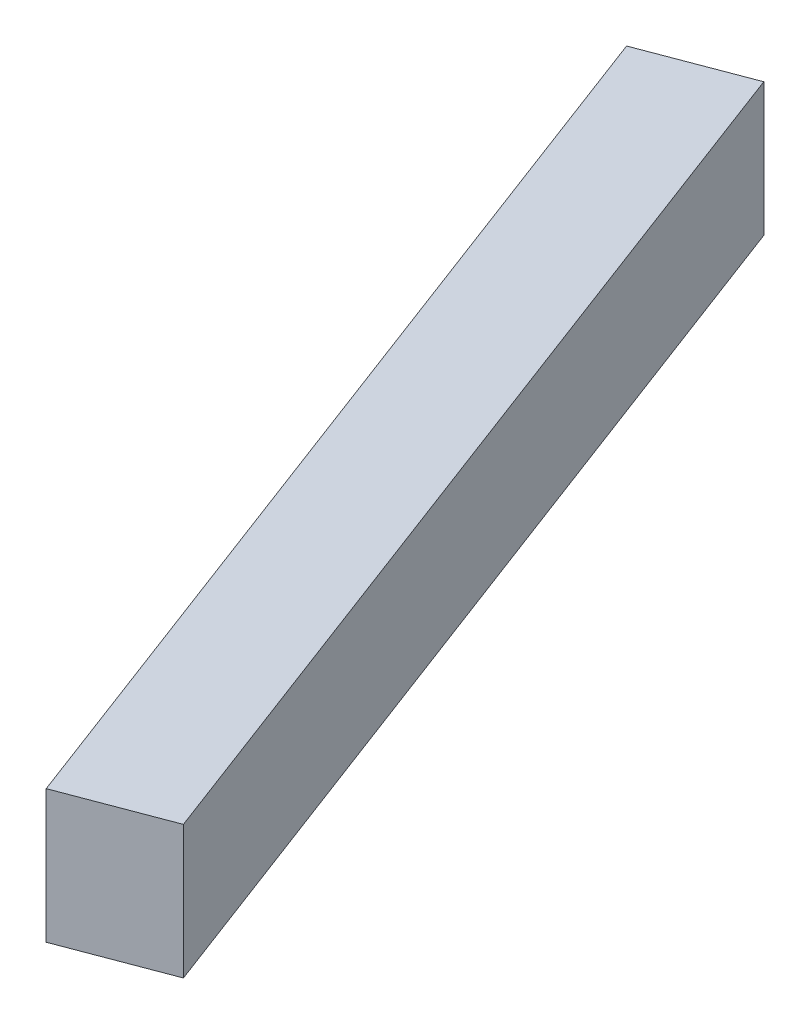
ISO-10303-21;
HEADER;
FILE_DESCRIPTION(('STEP AP214'),'2;1');
FILE_NAME('part.step','',(''),(''),'','','');
FILE_SCHEMA(('AUTOMOTIVE_DESIGN { 1 0 10303 214 1 1 1 1 }'));
ENDSEC;
DATA;
#1=APPLICATION_CONTEXT('core data for automotive mechanical design processes');
#2=APPLICATION_PROTOCOL_DEFINITION('international standard','automotive_design',2000,#1);
#3=PRODUCT_CONTEXT('',#1,'mechanical');
#4=PRODUCT('Part','Part','',(#3));
#5=PRODUCT_RELATED_PRODUCT_CATEGORY('part','',(#4));
#6=PRODUCT_DEFINITION_FORMATION('','',#4);
#7=PRODUCT_DEFINITION_CONTEXT('part definition',#1,'design');
#8=PRODUCT_DEFINITION('design','',#6,#7);
#9=PRODUCT_DEFINITION_SHAPE('','',#8);
#10=(LENGTH_UNIT() NAMED_UNIT(*) SI_UNIT(.MILLI.,.METRE.));
#11=(NAMED_UNIT(*) PLANE_ANGLE_UNIT() SI_UNIT($,.RADIAN.));
#12=(NAMED_UNIT(*) SI_UNIT($,.STERADIAN.) SOLID_ANGLE_UNIT());
#13=UNCERTAINTY_MEASURE_WITH_UNIT(LENGTH_MEASURE(1.E-05),#10,'distance_accuracy_value','');
#14=(GEOMETRIC_REPRESENTATION_CONTEXT(3) GLOBAL_UNCERTAINTY_ASSIGNED_CONTEXT((#13)) GLOBAL_UNIT_ASSIGNED_CONTEXT((#10,
#11,#12)) REPRESENTATION_CONTEXT('',''));
#15=CARTESIAN_POINT('',(0.,0.,0.));
#16=DIRECTION('',(0.,0.,1.));
#17=DIRECTION('',(1.,0.,0.));
#18=AXIS2_PLACEMENT_3D('',#15,#16,#17);
#19=CARTESIAN_POINT('',(6.46090269623637,7.874,16.79833615559));
#20=DIRECTION('',(-0.93535351711758,0.,0.353714288679116));
#21=DIRECTION('',(0.353714288679116,0.,0.93535351711758));
#22=AXIS2_PLACEMENT_3D('',#19,#20,#21);
#23=PLANE('',#22);
#24=DIRECTION('',(0.,1.,0.));
#25=VECTOR('',#24,1.);
#26=CARTESIAN_POINT('',(6.46090269623637,7.874,16.79833615559));
#27=LINE('',#26,#25);
#28=CARTESIAN_POINT('',(6.46090269623637,7.62,16.79833615559));
#29=VERTEX_POINT('',#28);
#30=CARTESIAN_POINT('',(6.46090269623637,7.874,16.79833615559));
#31=VERTEX_POINT('',#30);
#32=EDGE_CURVE('E20',#29,#31,#27,.T.);
#33=ORIENTED_EDGE('',*,*,#32,.T.);
#34=DIRECTION('',(0.353714288679116,0.,0.93535351711758));
#35=VECTOR('',#34,1.);
#36=CARTESIAN_POINT('',(6.46090269623637,7.874,16.79833615559));
#37=LINE('',#36,#35);
#38=CARTESIAN_POINT('',(7.13472841617009,7.874,18.580184605699));
#39=VERTEX_POINT('',#38);
#40=EDGE_CURVE('E55',#31,#39,#37,.T.);
#41=ORIENTED_EDGE('',*,*,#40,.T.);
#42=DIRECTION('',(0.,1.,0.));
#43=VECTOR('',#42,1.);
#44=CARTESIAN_POINT('',(7.13472841617009,7.874,18.580184605699));
#45=LINE('',#44,#43);
#46=CARTESIAN_POINT('',(7.13472841617009,7.62,18.580184605699));
#47=VERTEX_POINT('',#46);
#48=EDGE_CURVE('E76',#39,#47,#45,.F.);
#49=ORIENTED_EDGE('',*,*,#48,.T.);
#50=DIRECTION('',(0.353714288679116,0.,0.93535351711758));
#51=VECTOR('',#50,1.);
#52=CARTESIAN_POINT('',(6.46090269623637,7.62,16.79833615559));
#53=LINE('',#52,#51);
#54=EDGE_CURVE('E58',#29,#47,#53,.T.);
#55=ORIENTED_EDGE('',*,*,#54,.F.);
#56=EDGE_LOOP('',(#33,#41,#49,#55));
#57=FACE_BOUND('',#56,.T.);
#58=ADVANCED_FACE('F17',(#57),#23,.F.);
#59=CARTESIAN_POINT('',(6.46090269623637,7.874,16.79833615559));
#60=DIRECTION('',(0.35371428867914,0.,0.935353517117571));
#61=DIRECTION('',(0.935353517117571,0.,-0.35371428867914));
#62=AXIS2_PLACEMENT_3D('',#59,#60,#61);
#63=PLANE('',#62);
#64=DIRECTION('',(0.,1.,0.));
#65=VECTOR('',#64,1.);
#66=CARTESIAN_POINT('',(6.27083886155808,7.874,16.8702108990496));
#67=LINE('',#66,#65);
#68=CARTESIAN_POINT('',(6.27083886155808,7.62,16.8702108990496));
#69=VERTEX_POINT('',#68);
#70=CARTESIAN_POINT('',(6.27083886155808,7.874,16.8702108990496));
#71=VERTEX_POINT('',#70);
#72=EDGE_CURVE('E73',#69,#71,#67,.T.);
#73=ORIENTED_EDGE('',*,*,#72,.T.);
#74=DIRECTION('',(0.935353517117574,0.,-0.353714288679133));
#75=VECTOR('',#74,1.);
#76=CARTESIAN_POINT('',(6.27083886155808,7.874,16.8702108990496));
#77=LINE('',#76,#75);
#78=EDGE_CURVE('E63',#71,#31,#77,.T.);
#79=ORIENTED_EDGE('',*,*,#78,.T.);
#80=ORIENTED_EDGE('',*,*,#32,.F.);
#81=DIRECTION('',(0.935353517117574,0.,-0.353714288679133));
#82=VECTOR('',#81,1.);
#83=CARTESIAN_POINT('',(6.27083886155808,7.62,16.8702108990496));
#84=LINE('',#83,#82);
#85=EDGE_CURVE('E80',#69,#29,#84,.T.);
#86=ORIENTED_EDGE('',*,*,#85,.F.);
#87=EDGE_LOOP('',(#73,#79,#80,#86));
#88=FACE_BOUND('',#87,.T.);
#89=ADVANCED_FACE('F72',(#88),#63,.F.);
#90=CARTESIAN_POINT('',(6.46090269623637,7.874,16.79833615559));
#91=DIRECTION('',(0.,-1.,0.));
#92=DIRECTION('',(0.,0.,-1.));
#93=AXIS2_PLACEMENT_3D('',#90,#91,#92);
#94=PLANE('',#93);
#95=ORIENTED_EDGE('',*,*,#78,.F.);
#96=DIRECTION('',(-0.353714288679117,0.,-0.93535351711758));
#97=VECTOR('',#96,1.);
#98=CARTESIAN_POINT('',(6.27083886155808,7.874,16.8702108990496));
#99=LINE('',#98,#97);
#100=CARTESIAN_POINT('',(6.94466458160121,7.874,18.6520593494479));
#101=VERTEX_POINT('',#100);
#102=EDGE_CURVE('E83',#71,#101,#99,.F.);
#103=ORIENTED_EDGE('',*,*,#102,.T.);
#104=DIRECTION('',(-0.93535351657911,0.,0.353714290103032));
#105=VECTOR('',#104,1.);
#106=CARTESIAN_POINT('',(7.13472841617009,7.874,18.580184605699));
#107=LINE('',#106,#105);
#108=EDGE_CURVE('E69',#101,#39,#107,.F.);
#109=ORIENTED_EDGE('',*,*,#108,.T.);
#110=ORIENTED_EDGE('',*,*,#40,.F.);
#111=EDGE_LOOP('',(#95,#103,#109,#110));
#112=FACE_BOUND('',#111,.T.);
#113=ADVANCED_FACE('F66',(#112),#94,.F.);
#114=CARTESIAN_POINT('',(7.13472841617009,7.874,18.580184605699));
#115=DIRECTION('',(-0.353714290103032,0.,-0.93535351657911));
#116=DIRECTION('',(-0.93535351657911,0.,0.353714290103032));
#117=AXIS2_PLACEMENT_3D('',#114,#115,#116);
#118=PLANE('',#117);
#119=ORIENTED_EDGE('',*,*,#48,.F.);
#120=ORIENTED_EDGE('',*,*,#108,.F.);
#121=DIRECTION('',(0.,1.,0.));
#122=VECTOR('',#121,1.);
#123=CARTESIAN_POINT('',(6.94466458160121,7.874,18.6520593494479));
#124=LINE('',#123,#122);
#125=CARTESIAN_POINT('',(6.94466458160122,7.62,18.6520593494479));
#126=VERTEX_POINT('',#125);
#127=EDGE_CURVE('E26',#101,#126,#124,.F.);
#128=ORIENTED_EDGE('',*,*,#127,.T.);
#129=DIRECTION('',(-0.935353516579174,0.,0.353714290102864));
#130=VECTOR('',#129,1.);
#131=CARTESIAN_POINT('',(7.13472841617009,7.62,18.580184605699));
#132=LINE('',#131,#130);
#133=EDGE_CURVE('E34',#47,#126,#132,.T.);
#134=ORIENTED_EDGE('',*,*,#133,.F.);
#135=EDGE_LOOP('',(#119,#120,#128,#134));
#136=FACE_BOUND('',#135,.T.);
#137=ADVANCED_FACE('F88',(#136),#118,.F.);
#138=CARTESIAN_POINT('',(6.46090269623637,7.62,16.79833615559));
#139=DIRECTION('',(0.,-1.,0.));
#140=DIRECTION('',(0.,0.,-1.));
#141=AXIS2_PLACEMENT_3D('',#138,#139,#140);
#142=PLANE('',#141);
#143=DIRECTION('',(-0.353714288679117,0.,-0.93535351711758));
#144=VECTOR('',#143,1.);
#145=CARTESIAN_POINT('',(6.27083886155808,7.62,16.8702108990496));
#146=LINE('',#145,#144);
#147=EDGE_CURVE('E11',#126,#69,#146,.T.);
#148=ORIENTED_EDGE('',*,*,#147,.T.);
#149=ORIENTED_EDGE('',*,*,#85,.T.);
#150=ORIENTED_EDGE('',*,*,#54,.T.);
#151=ORIENTED_EDGE('',*,*,#133,.T.);
#152=EDGE_LOOP('',(#148,#149,#150,#151));
#153=FACE_BOUND('',#152,.T.);
#154=ADVANCED_FACE('F91',(#153),#142,.T.);
#155=CARTESIAN_POINT('',(6.27083886155808,7.874,16.8702108990496));
#156=DIRECTION('',(0.93535351711758,0.,-0.353714288679117));
#157=DIRECTION('',(-0.353714288679117,0.,-0.93535351711758));
#158=AXIS2_PLACEMENT_3D('',#155,#156,#157);
#159=PLANE('',#158);
#160=ORIENTED_EDGE('',*,*,#127,.F.);
#161=ORIENTED_EDGE('',*,*,#102,.F.);
#162=ORIENTED_EDGE('',*,*,#72,.F.);
#163=ORIENTED_EDGE('',*,*,#147,.F.);
#164=EDGE_LOOP('',(#160,#161,#162,#163));
#165=FACE_BOUND('',#164,.T.);
#166=ADVANCED_FACE('F90',(#165),#159,.F.);
#167=CLOSED_SHELL('',(#58,#89,#113,#137,#154,#166));
#168=MANIFOLD_SOLID_BREP('B1',#167);
#169=ADVANCED_BREP_SHAPE_REPRESENTATION('',(#18,#168),#14);
#170=SHAPE_DEFINITION_REPRESENTATION(#9,#169);
ENDSEC;
END-ISO-10303-21;
